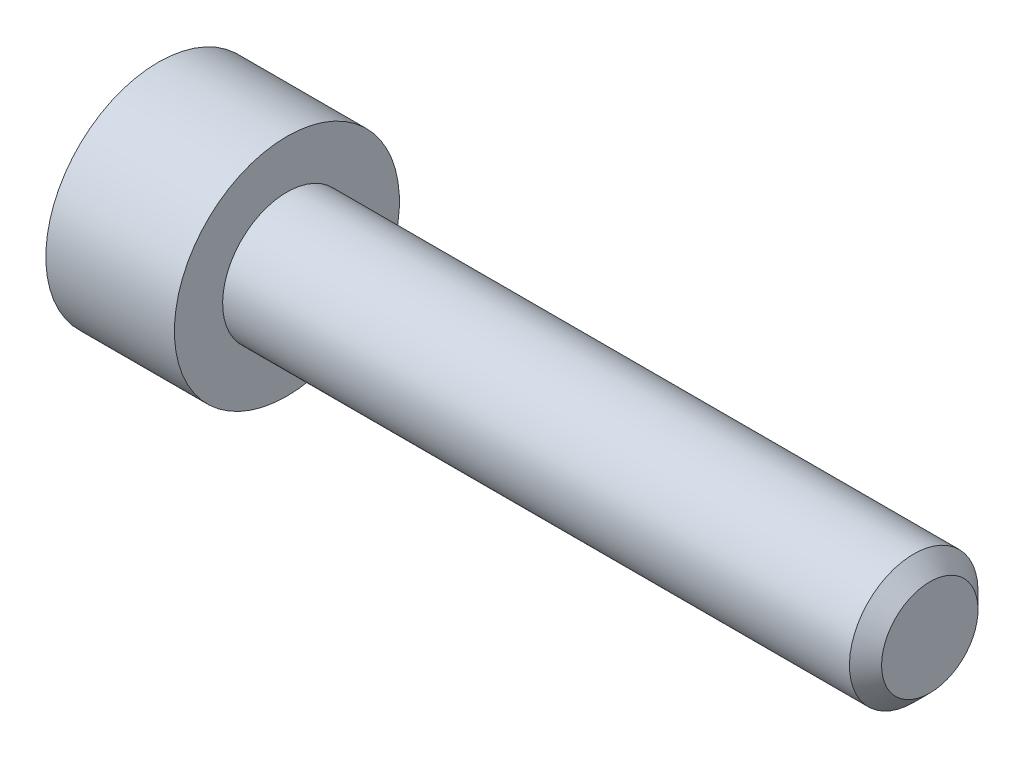
ISO-10303-21;
HEADER;
FILE_DESCRIPTION(('STEP AP214'),'2;1');
FILE_NAME('part.step','',(''),(''),'','','');
FILE_SCHEMA(('AUTOMOTIVE_DESIGN { 1 0 10303 214 1 1 1 1 }'));
ENDSEC;
DATA;
#1=APPLICATION_CONTEXT('core data for automotive mechanical design processes');
#2=APPLICATION_PROTOCOL_DEFINITION('international standard','automotive_design',2000,#1);
#3=PRODUCT_CONTEXT('',#1,'mechanical');
#4=PRODUCT('Part','Part','',(#3));
#5=PRODUCT_RELATED_PRODUCT_CATEGORY('part','',(#4));
#6=PRODUCT_DEFINITION_FORMATION('','',#4);
#7=PRODUCT_DEFINITION_CONTEXT('part definition',#1,'design');
#8=PRODUCT_DEFINITION('design','',#6,#7);
#9=PRODUCT_DEFINITION_SHAPE('','',#8);
#10=(LENGTH_UNIT() NAMED_UNIT(*) SI_UNIT(.MILLI.,.METRE.));
#11=(NAMED_UNIT(*) PLANE_ANGLE_UNIT() SI_UNIT($,.RADIAN.));
#12=(NAMED_UNIT(*) SI_UNIT($,.STERADIAN.) SOLID_ANGLE_UNIT());
#13=UNCERTAINTY_MEASURE_WITH_UNIT(LENGTH_MEASURE(1.E-05),#10,'distance_accuracy_value','');
#14=(GEOMETRIC_REPRESENTATION_CONTEXT(3) GLOBAL_UNCERTAINTY_ASSIGNED_CONTEXT((#13)) GLOBAL_UNIT_ASSIGNED_CONTEXT((#10,
#11,#12)) REPRESENTATION_CONTEXT('',''));
#15=CARTESIAN_POINT('',(0.,0.,0.));
#16=DIRECTION('',(0.,0.,1.));
#17=DIRECTION('',(1.,0.,0.));
#18=AXIS2_PLACEMENT_3D('',#15,#16,#17);
#19=CARTESIAN_POINT('',(-4.,0.,0.));
#20=DIRECTION('',(1.,0.,0.));
#21=DIRECTION('',(0.,1.,0.));
#22=AXIS2_PLACEMENT_3D('',#19,#20,#21);
#23=PLANE('',#22);
#24=CARTESIAN_POINT('',(-4.,0.,0.));
#25=DIRECTION('',(-1.,0.,0.));
#26=DIRECTION('',(0.,-1.,0.));
#27=AXIS2_PLACEMENT_3D('',#24,#25,#26);
#28=CIRCLE('',#27,3.5);
#29=CARTESIAN_POINT('',(-4.,-3.5,0.));
#30=VERTEX_POINT('',#29);
#31=EDGE_CURVE('E11',#30,#30,#28,.T.);
#32=ORIENTED_EDGE('',*,*,#31,.T.);
#33=EDGE_LOOP('',(#32));
#34=FACE_BOUND('',#33,.T.);
#35=DIRECTION('',(0.,-0.5,-0.866025403784439));
#36=VECTOR('',#35,1.);
#37=CARTESIAN_POINT('',(-4.,-0.866025403784439,1.5));
#38=LINE('',#37,#36);
#39=CARTESIAN_POINT('',(-4.,-0.866025403784439,1.5));
#40=VERTEX_POINT('',#39);
#41=CARTESIAN_POINT('',(-4.,-1.73205080756888,0.));
#42=VERTEX_POINT('',#41);
#43=EDGE_CURVE('E193',#40,#42,#38,.T.);
#44=ORIENTED_EDGE('',*,*,#43,.T.);
#45=DIRECTION('',(0.,0.5,-0.866025403784439));
#46=VECTOR('',#45,1.);
#47=CARTESIAN_POINT('',(-4.,-1.73205080756888,0.));
#48=LINE('',#47,#46);
#49=CARTESIAN_POINT('',(-4.,-0.866025403784439,-1.5));
#50=VERTEX_POINT('',#49);
#51=EDGE_CURVE('E196',#42,#50,#48,.T.);
#52=ORIENTED_EDGE('',*,*,#51,.T.);
#53=DIRECTION('',(0.,1.,0.));
#54=VECTOR('',#53,1.);
#55=CARTESIAN_POINT('',(-4.,-0.866025403784439,-1.5));
#56=LINE('',#55,#54);
#57=CARTESIAN_POINT('',(-4.,0.866025403784439,-1.5));
#58=VERTEX_POINT('',#57);
#59=EDGE_CURVE('E208',#50,#58,#56,.T.);
#60=ORIENTED_EDGE('',*,*,#59,.T.);
#61=DIRECTION('',(0.,0.5,0.866025403784439));
#62=VECTOR('',#61,1.);
#63=CARTESIAN_POINT('',(-4.,0.866025403784439,-1.5));
#64=LINE('',#63,#62);
#65=CARTESIAN_POINT('',(-4.,1.73205080756888,0.));
#66=VERTEX_POINT('',#65);
#67=EDGE_CURVE('E119',#58,#66,#64,.T.);
#68=ORIENTED_EDGE('',*,*,#67,.T.);
#69=DIRECTION('',(0.,-0.5,0.866025403784439));
#70=VECTOR('',#69,1.);
#71=CARTESIAN_POINT('',(-4.,1.73205080756888,0.));
#72=LINE('',#71,#70);
#73=CARTESIAN_POINT('',(-4.,0.866025403784439,1.5));
#74=VERTEX_POINT('',#73);
#75=EDGE_CURVE('E232',#66,#74,#72,.T.);
#76=ORIENTED_EDGE('',*,*,#75,.T.);
#77=DIRECTION('',(0.,-1.,0.));
#78=VECTOR('',#77,1.);
#79=CARTESIAN_POINT('',(-4.,0.866025403784439,1.5));
#80=LINE('',#79,#78);
#81=EDGE_CURVE('E134',#74,#40,#80,.T.);
#82=ORIENTED_EDGE('',*,*,#81,.T.);
#83=EDGE_LOOP('',(#44,#52,#60,#68,#76,#82));
#84=FACE_BOUND('',#83,.T.);
#85=ADVANCED_FACE('F36',(#34,#84),#23,.F.);
#86=CARTESIAN_POINT('',(20.,0.,0.));
#87=DIRECTION('',(-1.,0.,0.));
#88=DIRECTION('',(0.,-1.,0.));
#89=AXIS2_PLACEMENT_3D('',#86,#87,#88);
#90=CYLINDRICAL_SURFACE('',#89,3.5);
#91=ORIENTED_EDGE('',*,*,#31,.F.);
#92=EDGE_LOOP('',(#91));
#93=FACE_BOUND('',#92,.T.);
#94=CARTESIAN_POINT('',(0.,0.,0.));
#95=DIRECTION('',(-1.,0.,0.));
#96=DIRECTION('',(0.,-1.,0.));
#97=AXIS2_PLACEMENT_3D('',#94,#95,#96);
#98=CIRCLE('',#97,3.5);
#99=CARTESIAN_POINT('',(0.,-3.5,0.));
#100=VERTEX_POINT('',#99);
#101=EDGE_CURVE('E43',#100,#100,#98,.T.);
#102=ORIENTED_EDGE('',*,*,#101,.T.);
#103=EDGE_LOOP('',(#102));
#104=FACE_BOUND('',#103,.T.);
#105=ADVANCED_FACE('F156',(#93,#104),#90,.T.);
#106=CARTESIAN_POINT('',(0.,3.5,0.));
#107=DIRECTION('',(-1.,0.,0.));
#108=DIRECTION('',(0.,-1.,0.));
#109=AXIS2_PLACEMENT_3D('',#106,#107,#108);
#110=PLANE('',#109);
#111=ORIENTED_EDGE('',*,*,#101,.F.);
#112=EDGE_LOOP('',(#111));
#113=FACE_BOUND('',#112,.T.);
#114=CARTESIAN_POINT('',(0.,0.,0.));
#115=DIRECTION('',(-1.,0.,0.));
#116=DIRECTION('',(0.,-1.,0.));
#117=AXIS2_PLACEMENT_3D('',#114,#115,#116);
#118=CIRCLE('',#117,2.);
#119=CARTESIAN_POINT('',(0.,-2.,0.));
#120=VERTEX_POINT('',#119);
#121=EDGE_CURVE('E151',#120,#120,#118,.T.);
#122=ORIENTED_EDGE('',*,*,#121,.T.);
#123=EDGE_LOOP('',(#122));
#124=FACE_BOUND('',#123,.T.);
#125=ADVANCED_FACE('F158',(#113,#124),#110,.F.);
#126=CARTESIAN_POINT('',(20.,0.,0.));
#127=DIRECTION('',(-1.,0.,0.));
#128=DIRECTION('',(0.,-1.,0.));
#129=AXIS2_PLACEMENT_3D('',#126,#127,#128);
#130=CYLINDRICAL_SURFACE('',#129,2.);
#131=ORIENTED_EDGE('',*,*,#121,.F.);
#132=EDGE_LOOP('',(#131));
#133=FACE_BOUND('',#132,.T.);
#134=CARTESIAN_POINT('',(19.5,0.,0.));
#135=DIRECTION('',(-1.,0.,0.));
#136=DIRECTION('',(0.,-1.,0.));
#137=AXIS2_PLACEMENT_3D('',#134,#135,#136);
#138=CIRCLE('',#137,2.);
#139=CARTESIAN_POINT('',(19.5,-2.,0.));
#140=VERTEX_POINT('',#139);
#141=EDGE_CURVE('E148',#140,#140,#138,.T.);
#142=ORIENTED_EDGE('',*,*,#141,.T.);
#143=EDGE_LOOP('',(#142));
#144=FACE_BOUND('',#143,.T.);
#145=ADVANCED_FACE('F161',(#133,#144),#130,.T.);
#146=CARTESIAN_POINT('',(20.,0.,0.));
#147=DIRECTION('',(-1.,0.,0.));
#148=DIRECTION('',(0.,-1.,0.));
#149=AXIS2_PLACEMENT_3D('',#146,#147,#148);
#150=CONICAL_SURFACE('',#149,1.5,0.785398163397448);
#151=ORIENTED_EDGE('',*,*,#141,.F.);
#152=EDGE_LOOP('',(#151));
#153=FACE_BOUND('',#152,.T.);
#154=CARTESIAN_POINT('',(20.,0.,0.));
#155=DIRECTION('',(-1.,0.,0.));
#156=DIRECTION('',(0.,-1.,0.));
#157=AXIS2_PLACEMENT_3D('',#154,#155,#156);
#158=CIRCLE('',#157,1.5);
#159=CARTESIAN_POINT('',(20.,-1.5,0.));
#160=VERTEX_POINT('',#159);
#161=EDGE_CURVE('E144',#160,#160,#158,.T.);
#162=ORIENTED_EDGE('',*,*,#161,.T.);
#163=EDGE_LOOP('',(#162));
#164=FACE_BOUND('',#163,.T.);
#165=ADVANCED_FACE('F167',(#153,#164),#150,.T.);
#166=CARTESIAN_POINT('',(20.,1.5,0.));
#167=DIRECTION('',(-1.,0.,0.));
#168=DIRECTION('',(0.,-1.,0.));
#169=AXIS2_PLACEMENT_3D('',#166,#167,#168);
#170=PLANE('',#169);
#171=ORIENTED_EDGE('',*,*,#161,.F.);
#172=EDGE_LOOP('',(#171));
#173=FACE_BOUND('',#172,.T.);
#174=ADVANCED_FACE('F173',(#173),#170,.F.);
#175=CARTESIAN_POINT('',(-2.,1.73205080756888,0.));
#176=DIRECTION('',(0.,-0.866025403784439,-0.5));
#177=DIRECTION('',(0.,0.5,-0.866025403784439));
#178=AXIS2_PLACEMENT_3D('',#175,#176,#177);
#179=PLANE('',#178);
#180=DIRECTION('',(0.,-0.5,0.866025403784439));
#181=VECTOR('',#180,1.);
#182=CARTESIAN_POINT('',(-2.,1.73205080756888,0.));
#183=LINE('',#182,#181);
#184=CARTESIAN_POINT('',(-2.,1.73205080756888,0.));
#185=VERTEX_POINT('',#184);
#186=CARTESIAN_POINT('',(-2.,1.29903810567666,0.75));
#187=VERTEX_POINT('',#186);
#188=EDGE_CURVE('E116',#185,#187,#183,.T.);
#189=ORIENTED_EDGE('',*,*,#188,.T.);
#190=CARTESIAN_POINT('',(-2.,0.866025403784439,1.5));
#191=VERTEX_POINT('',#190);
#192=EDGE_CURVE('E108',#187,#191,#183,.T.);
#193=ORIENTED_EDGE('',*,*,#192,.T.);
#194=DIRECTION('',(-1.,0.,0.));
#195=VECTOR('',#194,1.);
#196=CARTESIAN_POINT('',(-2.,0.866025403784439,1.5));
#197=LINE('',#196,#195);
#198=EDGE_CURVE('E113',#191,#74,#197,.T.);
#199=ORIENTED_EDGE('',*,*,#198,.T.);
#200=ORIENTED_EDGE('',*,*,#75,.F.);
#201=DIRECTION('',(-1.,0.,0.));
#202=VECTOR('',#201,1.);
#203=CARTESIAN_POINT('',(-2.,1.73205080756888,0.));
#204=LINE('',#203,#202);
#205=EDGE_CURVE('E214',#185,#66,#204,.T.);
#206=ORIENTED_EDGE('',*,*,#205,.F.);
#207=EDGE_LOOP('',(#189,#193,#199,#200,#206));
#208=FACE_BOUND('',#207,.T.);
#209=ADVANCED_FACE('F110',(#208),#179,.T.);
#210=CARTESIAN_POINT('',(-2.,0.866025403784439,1.5));
#211=DIRECTION('',(0.,0.,-1.));
#212=DIRECTION('',(-1.,0.,0.));
#213=AXIS2_PLACEMENT_3D('',#210,#211,#212);
#214=PLANE('',#213);
#215=DIRECTION('',(0.,-1.,0.));
#216=VECTOR('',#215,1.);
#217=CARTESIAN_POINT('',(-2.,0.866025403784439,1.5));
#218=LINE('',#217,#216);
#219=CARTESIAN_POINT('',(-2.,0.,1.5));
#220=VERTEX_POINT('',#219);
#221=EDGE_CURVE('E122',#191,#220,#218,.T.);
#222=ORIENTED_EDGE('',*,*,#221,.T.);
#223=CARTESIAN_POINT('',(-2.,-0.866025403784439,1.5));
#224=VERTEX_POINT('',#223);
#225=EDGE_CURVE('E129',#220,#224,#218,.T.);
#226=ORIENTED_EDGE('',*,*,#225,.T.);
#227=DIRECTION('',(-1.,0.,0.));
#228=VECTOR('',#227,1.);
#229=CARTESIAN_POINT('',(-2.,-0.866025403784439,1.5));
#230=LINE('',#229,#228);
#231=EDGE_CURVE('E136',#224,#40,#230,.T.);
#232=ORIENTED_EDGE('',*,*,#231,.T.);
#233=ORIENTED_EDGE('',*,*,#81,.F.);
#234=ORIENTED_EDGE('',*,*,#198,.F.);
#235=EDGE_LOOP('',(#222,#226,#232,#233,#234));
#236=FACE_BOUND('',#235,.T.);
#237=ADVANCED_FACE('F132',(#236),#214,.T.);
#238=CARTESIAN_POINT('',(-2.,-0.866025403784439,1.5));
#239=DIRECTION('',(0.,0.866025403784439,-0.5));
#240=DIRECTION('',(0.,0.5,0.866025403784439));
#241=AXIS2_PLACEMENT_3D('',#238,#239,#240);
#242=PLANE('',#241);
#243=DIRECTION('',(0.,-0.5,-0.866025403784439));
#244=VECTOR('',#243,1.);
#245=CARTESIAN_POINT('',(-2.,-0.866025403784439,1.5));
#246=LINE('',#245,#244);
#247=CARTESIAN_POINT('',(-2.,-1.29903810567666,0.75));
#248=VERTEX_POINT('',#247);
#249=EDGE_CURVE('E241',#224,#248,#246,.T.);
#250=ORIENTED_EDGE('',*,*,#249,.T.);
#251=CARTESIAN_POINT('',(-2.,-1.73205080756888,0.));
#252=VERTEX_POINT('',#251);
#253=EDGE_CURVE('E128',#248,#252,#246,.T.);
#254=ORIENTED_EDGE('',*,*,#253,.T.);
#255=DIRECTION('',(-1.,0.,0.));
#256=VECTOR('',#255,1.);
#257=CARTESIAN_POINT('',(-2.,-1.73205080756888,0.));
#258=LINE('',#257,#256);
#259=EDGE_CURVE('E140',#252,#42,#258,.T.);
#260=ORIENTED_EDGE('',*,*,#259,.T.);
#261=ORIENTED_EDGE('',*,*,#43,.F.);
#262=ORIENTED_EDGE('',*,*,#231,.F.);
#263=EDGE_LOOP('',(#250,#254,#260,#261,#262));
#264=FACE_BOUND('',#263,.T.);
#265=ADVANCED_FACE('F202',(#264),#242,.T.);
#266=CARTESIAN_POINT('',(-2.,-1.73205080756888,0.));
#267=DIRECTION('',(0.,0.866025403784439,0.5));
#268=DIRECTION('',(0.,-0.5,0.866025403784439));
#269=AXIS2_PLACEMENT_3D('',#266,#267,#268);
#270=PLANE('',#269);
#271=DIRECTION('',(0.,0.5,-0.866025403784439));
#272=VECTOR('',#271,1.);
#273=CARTESIAN_POINT('',(-2.,-1.73205080756888,0.));
#274=LINE('',#273,#272);
#275=CARTESIAN_POINT('',(-2.,-1.29903810567666,-0.75));
#276=VERTEX_POINT('',#275);
#277=EDGE_CURVE('E50',#252,#276,#274,.T.);
#278=ORIENTED_EDGE('',*,*,#277,.T.);
#279=CARTESIAN_POINT('',(-2.,-0.866025403784439,-1.5));
#280=VERTEX_POINT('',#279);
#281=EDGE_CURVE('E240',#276,#280,#274,.T.);
#282=ORIENTED_EDGE('',*,*,#281,.T.);
#283=DIRECTION('',(-1.,0.,0.));
#284=VECTOR('',#283,1.);
#285=CARTESIAN_POINT('',(-2.,-0.866025403784439,-1.5));
#286=LINE('',#285,#284);
#287=EDGE_CURVE('E204',#280,#50,#286,.T.);
#288=ORIENTED_EDGE('',*,*,#287,.T.);
#289=ORIENTED_EDGE('',*,*,#51,.F.);
#290=ORIENTED_EDGE('',*,*,#259,.F.);
#291=EDGE_LOOP('',(#278,#282,#288,#289,#290));
#292=FACE_BOUND('',#291,.T.);
#293=ADVANCED_FACE('F205',(#292),#270,.T.);
#294=CARTESIAN_POINT('',(-2.,-0.866025403784439,-1.5));
#295=DIRECTION('',(0.,0.,1.));
#296=DIRECTION('',(1.,0.,0.));
#297=AXIS2_PLACEMENT_3D('',#294,#295,#296);
#298=PLANE('',#297);
#299=DIRECTION('',(0.,1.,0.));
#300=VECTOR('',#299,1.);
#301=CARTESIAN_POINT('',(-2.,-0.866025403784439,-1.5));
#302=LINE('',#301,#300);
#303=CARTESIAN_POINT('',(-2.,0.,-1.5));
#304=VERTEX_POINT('',#303);
#305=EDGE_CURVE('E237',#280,#304,#302,.T.);
#306=ORIENTED_EDGE('',*,*,#305,.T.);
#307=CARTESIAN_POINT('',(-2.,0.866025403784439,-1.5));
#308=VERTEX_POINT('',#307);
#309=EDGE_CURVE('E227',#304,#308,#302,.T.);
#310=ORIENTED_EDGE('',*,*,#309,.T.);
#311=DIRECTION('',(-1.,0.,0.));
#312=VECTOR('',#311,1.);
#313=CARTESIAN_POINT('',(-2.,0.866025403784439,-1.5));
#314=LINE('',#313,#312);
#315=EDGE_CURVE('E217',#308,#58,#314,.T.);
#316=ORIENTED_EDGE('',*,*,#315,.T.);
#317=ORIENTED_EDGE('',*,*,#59,.F.);
#318=ORIENTED_EDGE('',*,*,#287,.F.);
#319=EDGE_LOOP('',(#306,#310,#316,#317,#318));
#320=FACE_BOUND('',#319,.T.);
#321=ADVANCED_FACE('F225',(#320),#298,.T.);
#322=CARTESIAN_POINT('',(-2.,0.866025403784439,-1.5));
#323=DIRECTION('',(0.,-0.866025403784439,0.5));
#324=DIRECTION('',(0.,-0.5,-0.866025403784439));
#325=AXIS2_PLACEMENT_3D('',#322,#323,#324);
#326=PLANE('',#325);
#327=DIRECTION('',(0.,0.5,0.866025403784439));
#328=VECTOR('',#327,1.);
#329=CARTESIAN_POINT('',(-2.,0.866025403784439,-1.5));
#330=LINE('',#329,#328);
#331=CARTESIAN_POINT('',(-2.,1.29903810567666,-0.75));
#332=VERTEX_POINT('',#331);
#333=EDGE_CURVE('E218',#308,#332,#330,.T.);
#334=ORIENTED_EDGE('',*,*,#333,.T.);
#335=EDGE_CURVE('E236',#332,#185,#330,.T.);
#336=ORIENTED_EDGE('',*,*,#335,.T.);
#337=ORIENTED_EDGE('',*,*,#205,.T.);
#338=ORIENTED_EDGE('',*,*,#67,.F.);
#339=ORIENTED_EDGE('',*,*,#315,.F.);
#340=EDGE_LOOP('',(#334,#336,#337,#338,#339));
#341=FACE_BOUND('',#340,.T.);
#342=ADVANCED_FACE('F231',(#341),#326,.T.);
#343=CARTESIAN_POINT('',(-2.,0.,0.));
#344=DIRECTION('',(1.,0.,0.));
#345=DIRECTION('',(0.,0.,-1.));
#346=AXIS2_PLACEMENT_3D('',#343,#344,#345);
#347=PLANE('',#346);
#348=CARTESIAN_POINT('',(-2.,0.,0.));
#349=DIRECTION('',(-1.,0.,0.));
#350=DIRECTION('',(0.,0.,1.));
#351=AXIS2_PLACEMENT_3D('',#348,#349,#350);
#352=CIRCLE('',#351,1.5);
#353=EDGE_CURVE('E255',#332,#304,#352,.T.);
#354=ORIENTED_EDGE('',*,*,#353,.F.);
#355=ORIENTED_EDGE('',*,*,#333,.F.);
#356=ORIENTED_EDGE('',*,*,#309,.F.);
#357=EDGE_LOOP('',(#354,#355,#356));
#358=FACE_BOUND('',#357,.T.);
#359=ADVANCED_FACE('F262',(#358),#347,.F.);
#360=EDGE_CURVE('E145',#187,#332,#352,.T.);
#361=ORIENTED_EDGE('',*,*,#360,.F.);
#362=ORIENTED_EDGE('',*,*,#188,.F.);
#363=ORIENTED_EDGE('',*,*,#335,.F.);
#364=EDGE_LOOP('',(#361,#362,#363));
#365=FACE_BOUND('',#364,.T.);
#366=ADVANCED_FACE('F260',(#365),#347,.F.);
#367=EDGE_CURVE('E124',#220,#187,#352,.T.);
#368=ORIENTED_EDGE('',*,*,#367,.F.);
#369=ORIENTED_EDGE('',*,*,#221,.F.);
#370=ORIENTED_EDGE('',*,*,#192,.F.);
#371=EDGE_LOOP('',(#368,#369,#370));
#372=FACE_BOUND('',#371,.T.);
#373=ADVANCED_FACE('F123',(#372),#347,.F.);
#374=EDGE_CURVE('E135',#248,#220,#352,.T.);
#375=ORIENTED_EDGE('',*,*,#374,.F.);
#376=ORIENTED_EDGE('',*,*,#249,.F.);
#377=ORIENTED_EDGE('',*,*,#225,.F.);
#378=EDGE_LOOP('',(#375,#376,#377));
#379=FACE_BOUND('',#378,.T.);
#380=ADVANCED_FACE('F245',(#379),#347,.F.);
#381=EDGE_CURVE('E138',#276,#248,#352,.T.);
#382=ORIENTED_EDGE('',*,*,#381,.F.);
#383=ORIENTED_EDGE('',*,*,#277,.F.);
#384=ORIENTED_EDGE('',*,*,#253,.F.);
#385=EDGE_LOOP('',(#382,#383,#384));
#386=FACE_BOUND('',#385,.T.);
#387=ADVANCED_FACE('F249',(#386),#347,.F.);
#388=EDGE_CURVE('E251',#304,#276,#352,.T.);
#389=ORIENTED_EDGE('',*,*,#388,.F.);
#390=ORIENTED_EDGE('',*,*,#305,.F.);
#391=ORIENTED_EDGE('',*,*,#281,.F.);
#392=EDGE_LOOP('',(#389,#390,#391));
#393=FACE_BOUND('',#392,.T.);
#394=ADVANCED_FACE('F263',(#393),#347,.F.);
#395=CARTESIAN_POINT('',(-1.59807621135332,0.,0.));
#396=DIRECTION('',(-1.,0.,0.));
#397=DIRECTION('',(0.,0.,1.));
#398=AXIS2_PLACEMENT_3D('',#395,#396,#397);
#399=CONICAL_SURFACE('',#398,0.,1.30899693899575);
#400=ORIENTED_EDGE('',*,*,#367,.T.);
#401=ORIENTED_EDGE('',*,*,#360,.T.);
#402=ORIENTED_EDGE('',*,*,#353,.T.);
#403=ORIENTED_EDGE('',*,*,#388,.T.);
#404=ORIENTED_EDGE('',*,*,#381,.T.);
#405=ORIENTED_EDGE('',*,*,#374,.T.);
#406=EDGE_LOOP('',(#400,#401,#402,#403,#404,#405));
#407=FACE_BOUND('',#406,.T.);
#408=CARTESIAN_POINT('',(-1.59807621135332,0.,0.));
#409=VERTEX_POINT('',#408);
#410=VERTEX_LOOP('',#409);
#411=FACE_BOUND('',#410,.T.);
#412=ADVANCED_FACE('F253',(#407,#411),#399,.F.);
#413=CLOSED_SHELL('',(#85,#105,#125,#145,#165,#174,#209,#237,#265,#293,#321,#342,#359,#366,#373,
#380,#387,#394,#412));
#414=MANIFOLD_SOLID_BREP('B2',#413);
#415=ADVANCED_BREP_SHAPE_REPRESENTATION('',(#18,#414),#14);
#416=SHAPE_DEFINITION_REPRESENTATION(#9,#415);
ENDSEC;
END-ISO-10303-21;
